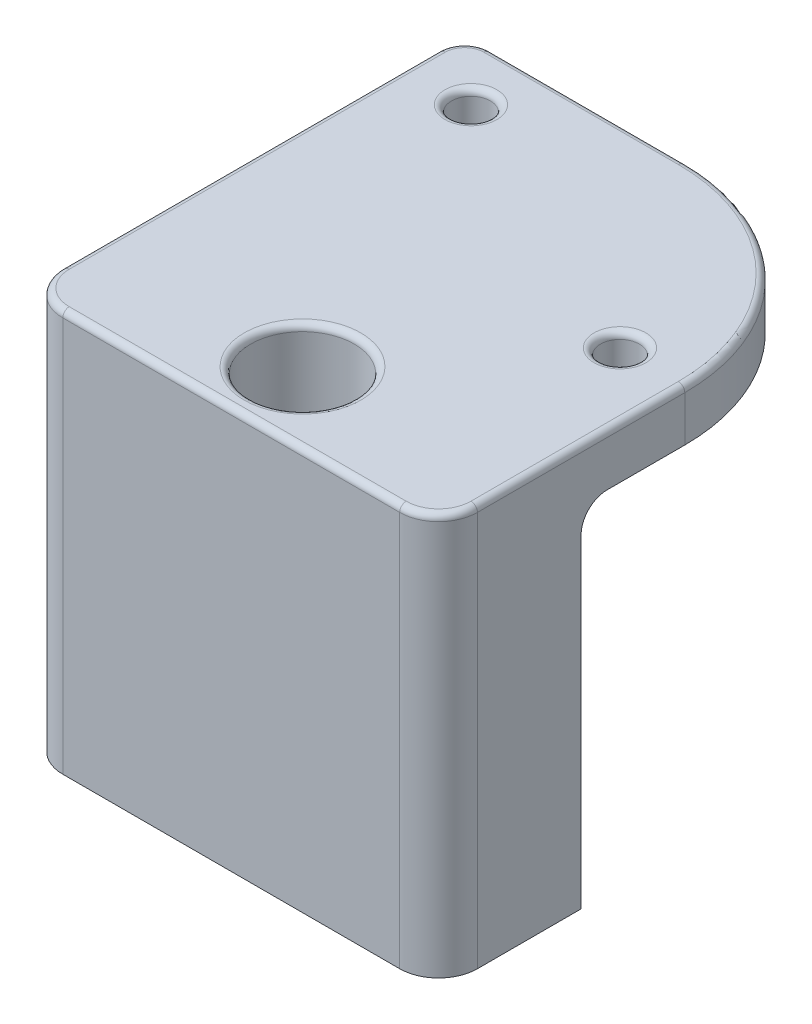
ISO-10303-21;
HEADER;
FILE_DESCRIPTION(('STEP AP214'),'2;1');
FILE_NAME('part.step','',(''),(''),'','','');
FILE_SCHEMA(('AUTOMOTIVE_DESIGN { 1 0 10303 214 1 1 1 1 }'));
ENDSEC;
DATA;
#1=APPLICATION_CONTEXT('core data for automotive mechanical design processes');
#2=APPLICATION_PROTOCOL_DEFINITION('international standard','automotive_design',2000,#1);
#3=PRODUCT_CONTEXT('',#1,'mechanical');
#4=PRODUCT('Part','Part','',(#3));
#5=PRODUCT_RELATED_PRODUCT_CATEGORY('part','',(#4));
#6=PRODUCT_DEFINITION_FORMATION('','',#4);
#7=PRODUCT_DEFINITION_CONTEXT('part definition',#1,'design');
#8=PRODUCT_DEFINITION('design','',#6,#7);
#9=PRODUCT_DEFINITION_SHAPE('','',#8);
#10=(LENGTH_UNIT() NAMED_UNIT(*) SI_UNIT(.MILLI.,.METRE.));
#11=(NAMED_UNIT(*) PLANE_ANGLE_UNIT() SI_UNIT($,.RADIAN.));
#12=(NAMED_UNIT(*) SI_UNIT($,.STERADIAN.) SOLID_ANGLE_UNIT());
#13=UNCERTAINTY_MEASURE_WITH_UNIT(LENGTH_MEASURE(1.E-05),#10,'distance_accuracy_value','');
#14=(GEOMETRIC_REPRESENTATION_CONTEXT(3) GLOBAL_UNCERTAINTY_ASSIGNED_CONTEXT((#13)) GLOBAL_UNIT_ASSIGNED_CONTEXT((#10,
#11,#12)) REPRESENTATION_CONTEXT('',''));
#15=CARTESIAN_POINT('',(0.,0.,0.));
#16=DIRECTION('',(0.,0.,1.));
#17=DIRECTION('',(1.,0.,0.));
#18=AXIS2_PLACEMENT_3D('',#15,#16,#17);
#19=CARTESIAN_POINT('',(17.,27.,-19.));
#20=DIRECTION('',(0.,1.,0.));
#21=DIRECTION('',(0.,0.,1.));
#22=AXIS2_PLACEMENT_3D('',#19,#20,#21);
#23=PLANE('',#22);
#24=CARTESIAN_POINT('',(27.,27.,-19.));
#25=DIRECTION('',(0.,1.,0.));
#26=DIRECTION('',(0.,0.,1.));
#27=AXIS2_PLACEMENT_3D('',#24,#25,#26);
#28=CIRCLE('',#27,1.5);
#29=CARTESIAN_POINT('',(27.,27.,-17.5));
#30=VERTEX_POINT('',#29);
#31=EDGE_CURVE('E176',#30,#30,#28,.T.);
#32=ORIENTED_EDGE('',*,*,#31,.T.);
#33=EDGE_LOOP('',(#32));
#34=FACE_BOUND('',#33,.T.);
#35=DIRECTION('',(0.,0.,1.));
#36=VECTOR('',#35,1.);
#37=CARTESIAN_POINT('',(0.,27.,0.));
#38=LINE('',#37,#36);
#39=CARTESIAN_POINT('',(0.,27.,-32.));
#40=VERTEX_POINT('',#39);
#41=CARTESIAN_POINT('',(0.,27.,-13.));
#42=VERTEX_POINT('',#41);
#43=EDGE_CURVE('E185',#40,#42,#38,.T.);
#44=ORIENTED_EDGE('',*,*,#43,.F.);
#45=CARTESIAN_POINT('',(2.,27.,-32.));
#46=DIRECTION('',(0.,1.,0.));
#47=DIRECTION('',(0.,0.,1.));
#48=AXIS2_PLACEMENT_3D('',#45,#46,#47);
#49=CIRCLE('',#48,2.);
#50=CARTESIAN_POINT('',(2.,27.,-34.));
#51=VERTEX_POINT('',#50);
#52=EDGE_CURVE('E260',#40,#51,#49,.F.);
#53=ORIENTED_EDGE('',*,*,#52,.T.);
#54=DIRECTION('',(-1.,0.,0.));
#55=VECTOR('',#54,1.);
#56=CARTESIAN_POINT('',(0.,27.,-34.));
#57=LINE('',#56,#55);
#58=CARTESIAN_POINT('',(16.9999999999999,27.,-34.));
#59=VERTEX_POINT('',#58);
#60=EDGE_CURVE('E181',#59,#51,#57,.T.);
#61=ORIENTED_EDGE('',*,*,#60,.F.);
#62=CARTESIAN_POINT('',(17.,27.,-19.));
#63=DIRECTION('',(0.,1.,0.));
#64=DIRECTION('',(0.,0.,1.));
#65=AXIS2_PLACEMENT_3D('',#62,#63,#64);
#66=CIRCLE('',#65,15.);
#67=CARTESIAN_POINT('',(32.,27.,-18.9999999999999));
#68=VERTEX_POINT('',#67);
#69=EDGE_CURVE('E157',#68,#59,#66,.T.);
#70=ORIENTED_EDGE('',*,*,#69,.F.);
#71=DIRECTION('',(0.,0.,-1.));
#72=VECTOR('',#71,1.);
#73=CARTESIAN_POINT('',(32.,27.,0.));
#74=LINE('',#73,#72);
#75=CARTESIAN_POINT('',(32.,27.,-13.));
#76=VERTEX_POINT('',#75);
#77=EDGE_CURVE('E167',#76,#68,#74,.T.);
#78=ORIENTED_EDGE('',*,*,#77,.F.);
#79=DIRECTION('',(-1.,0.,0.));
#80=VECTOR('',#79,1.);
#81=CARTESIAN_POINT('',(0.,27.,-13.));
#82=LINE('',#81,#80);
#83=EDGE_CURVE('E237',#76,#42,#82,.T.);
#84=ORIENTED_EDGE('',*,*,#83,.T.);
#85=EDGE_LOOP('',(#44,#53,#61,#70,#78,#84));
#86=FACE_BOUND('',#85,.T.);
#87=CARTESIAN_POINT('',(5.,27.,-29.5));
#88=DIRECTION('',(0.,1.,0.));
#89=DIRECTION('',(0.,0.,1.));
#90=AXIS2_PLACEMENT_3D('',#87,#88,#89);
#91=CIRCLE('',#90,3.);
#92=CARTESIAN_POINT('',(5.,27.,-26.5));
#93=VERTEX_POINT('',#92);
#94=EDGE_CURVE('E253',#93,#93,#91,.F.);
#95=ORIENTED_EDGE('',*,*,#94,.F.);
#96=EDGE_LOOP('',(#95));
#97=FACE_BOUND('',#96,.T.);
#98=ADVANCED_FACE('F39',(#34,#86,#97),#23,.F.);
#99=CARTESIAN_POINT('',(0.,0.,0.));
#100=DIRECTION('',(0.,-1.,0.));
#101=DIRECTION('',(0.,0.,-1.));
#102=AXIS2_PLACEMENT_3D('',#99,#100,#101);
#103=PLANE('',#102);
#104=DIRECTION('',(1.,0.,0.));
#105=VECTOR('',#104,1.);
#106=CARTESIAN_POINT('',(0.,0.,0.));
#107=LINE('',#106,#105);
#108=CARTESIAN_POINT('',(3.,0.,0.));
#109=VERTEX_POINT('',#108);
#110=CARTESIAN_POINT('',(29.,0.,0.));
#111=VERTEX_POINT('',#110);
#112=EDGE_CURVE('E200',#109,#111,#107,.T.);
#113=ORIENTED_EDGE('',*,*,#112,.F.);
#114=CARTESIAN_POINT('',(3.,0.,-3.));
#115=DIRECTION('',(0.,-1.,0.));
#116=DIRECTION('',(0.,0.,-1.));
#117=AXIS2_PLACEMENT_3D('',#114,#115,#116);
#118=CIRCLE('',#117,3.);
#119=CARTESIAN_POINT('',(0.,0.,-3.));
#120=VERTEX_POINT('',#119);
#121=EDGE_CURVE('E231',#109,#120,#118,.T.);
#122=ORIENTED_EDGE('',*,*,#121,.T.);
#123=DIRECTION('',(0.,0.,1.));
#124=VECTOR('',#123,1.);
#125=CARTESIAN_POINT('',(0.,0.,0.));
#126=LINE('',#125,#124);
#127=CARTESIAN_POINT('',(0.,0.,-11.));
#128=VERTEX_POINT('',#127);
#129=EDGE_CURVE('E196',#128,#120,#126,.T.);
#130=ORIENTED_EDGE('',*,*,#129,.F.);
#131=DIRECTION('',(-1.,0.,0.));
#132=VECTOR('',#131,1.);
#133=CARTESIAN_POINT('',(0.,0.,-11.));
#134=LINE('',#133,#132);
#135=CARTESIAN_POINT('',(32.,0.,-11.));
#136=VERTEX_POINT('',#135);
#137=EDGE_CURVE('E207',#136,#128,#134,.T.);
#138=ORIENTED_EDGE('',*,*,#137,.F.);
#139=DIRECTION('',(0.,0.,-1.));
#140=VECTOR('',#139,1.);
#141=CARTESIAN_POINT('',(32.,0.,0.));
#142=LINE('',#141,#140);
#143=CARTESIAN_POINT('',(32.,0.,-3.));
#144=VERTEX_POINT('',#143);
#145=EDGE_CURVE('E203',#144,#136,#142,.T.);
#146=ORIENTED_EDGE('',*,*,#145,.F.);
#147=CARTESIAN_POINT('',(29.,0.,-3.));
#148=DIRECTION('',(0.,-1.,0.));
#149=DIRECTION('',(0.,0.,-1.));
#150=AXIS2_PLACEMENT_3D('',#147,#148,#149);
#151=CIRCLE('',#150,3.);
#152=EDGE_CURVE('E220',#144,#111,#151,.T.);
#153=ORIENTED_EDGE('',*,*,#152,.T.);
#154=EDGE_LOOP('',(#113,#122,#130,#138,#146,#153));
#155=FACE_BOUND('',#154,.T.);
#156=CARTESIAN_POINT('',(16.,0.,-5.50000000000001));
#157=DIRECTION('',(0.,1.,0.));
#158=DIRECTION('',(0.,0.,1.));
#159=AXIS2_PLACEMENT_3D('',#156,#157,#158);
#160=CIRCLE('',#159,1.6);
#161=CARTESIAN_POINT('',(16.,0.,-3.9));
#162=VERTEX_POINT('',#161);
#163=EDGE_CURVE('E163',#162,#162,#160,.T.);
#164=ORIENTED_EDGE('',*,*,#163,.T.);
#165=EDGE_LOOP('',(#164));
#166=FACE_BOUND('',#165,.T.);
#167=ADVANCED_FACE('F400',(#155,#166),#103,.T.);
#168=CARTESIAN_POINT('',(0.,27.,0.));
#169=DIRECTION('',(1.,0.,0.));
#170=DIRECTION('',(0.,0.,-1.));
#171=AXIS2_PLACEMENT_3D('',#168,#169,#170);
#172=PLANE('',#171);
#173=DIRECTION('',(0.,-1.,0.));
#174=VECTOR('',#173,1.);
#175=CARTESIAN_POINT('',(0.,27.,-3.));
#176=LINE('',#175,#174);
#177=CARTESIAN_POINT('',(0.,30.5,-3.));
#178=VERTEX_POINT('',#177);
#179=EDGE_CURVE('E234',#120,#178,#176,.F.);
#180=ORIENTED_EDGE('',*,*,#179,.T.);
#181=DIRECTION('',(0.,0.,1.));
#182=VECTOR('',#181,1.);
#183=CARTESIAN_POINT('',(0.,30.5,-32.));
#184=LINE('',#183,#182);
#185=CARTESIAN_POINT('',(0.,30.5,-32.));
#186=VERTEX_POINT('',#185);
#187=EDGE_CURVE('E65',#178,#186,#184,.F.);
#188=ORIENTED_EDGE('',*,*,#187,.T.);
#189=DIRECTION('',(0.,-1.,0.));
#190=VECTOR('',#189,1.);
#191=CARTESIAN_POINT('',(0.,27.,-32.));
#192=LINE('',#191,#190);
#193=EDGE_CURVE('E257',#186,#40,#192,.T.);
#194=ORIENTED_EDGE('',*,*,#193,.T.);
#195=ORIENTED_EDGE('',*,*,#43,.T.);
#196=CARTESIAN_POINT('',(0.,25.,-13.));
#197=DIRECTION('',(1.,0.,0.));
#198=DIRECTION('',(0.,0.,-1.));
#199=AXIS2_PLACEMENT_3D('',#196,#197,#198);
#200=CIRCLE('',#199,2.);
#201=CARTESIAN_POINT('',(0.,25.,-11.));
#202=VERTEX_POINT('',#201);
#203=EDGE_CURVE('E248',#42,#202,#200,.T.);
#204=ORIENTED_EDGE('',*,*,#203,.T.);
#205=DIRECTION('',(0.,-1.,0.));
#206=VECTOR('',#205,1.);
#207=CARTESIAN_POINT('',(0.,27.,-11.));
#208=LINE('',#207,#206);
#209=EDGE_CURVE('E211',#202,#128,#208,.T.);
#210=ORIENTED_EDGE('',*,*,#209,.T.);
#211=ORIENTED_EDGE('',*,*,#129,.T.);
#212=EDGE_LOOP('',(#180,#188,#194,#195,#204,#210,#211));
#213=FACE_BOUND('',#212,.T.);
#214=ADVANCED_FACE('F405',(#213),#172,.F.);
#215=CARTESIAN_POINT('',(0.,27.,0.));
#216=DIRECTION('',(0.,0.,-1.));
#217=DIRECTION('',(-1.,0.,0.));
#218=AXIS2_PLACEMENT_3D('',#215,#216,#217);
#219=PLANE('',#218);
#220=DIRECTION('',(0.,-1.,0.));
#221=VECTOR('',#220,1.);
#222=CARTESIAN_POINT('',(29.,27.,0.));
#223=LINE('',#222,#221);
#224=CARTESIAN_POINT('',(29.,30.5,0.));
#225=VERTEX_POINT('',#224);
#226=EDGE_CURVE('E224',#111,#225,#223,.F.);
#227=ORIENTED_EDGE('',*,*,#226,.T.);
#228=DIRECTION('',(1.,0.,0.));
#229=VECTOR('',#228,1.);
#230=CARTESIAN_POINT('',(3.,30.5,0.));
#231=LINE('',#230,#229);
#232=CARTESIAN_POINT('',(3.,30.5,0.));
#233=VERTEX_POINT('',#232);
#234=EDGE_CURVE('E315',#225,#233,#231,.F.);
#235=ORIENTED_EDGE('',*,*,#234,.T.);
#236=DIRECTION('',(0.,-1.,0.));
#237=VECTOR('',#236,1.);
#238=CARTESIAN_POINT('',(3.,27.,0.));
#239=LINE('',#238,#237);
#240=EDGE_CURVE('E228',#233,#109,#239,.T.);
#241=ORIENTED_EDGE('',*,*,#240,.T.);
#242=ORIENTED_EDGE('',*,*,#112,.T.);
#243=EDGE_LOOP('',(#227,#235,#241,#242));
#244=FACE_BOUND('',#243,.T.);
#245=ADVANCED_FACE('F426',(#244),#219,.F.);
#246=CARTESIAN_POINT('',(32.,27.,0.));
#247=DIRECTION('',(-1.,0.,0.));
#248=DIRECTION('',(0.,0.,1.));
#249=AXIS2_PLACEMENT_3D('',#246,#247,#248);
#250=PLANE('',#249);
#251=DIRECTION('',(0.,-1.,0.));
#252=VECTOR('',#251,1.);
#253=CARTESIAN_POINT('',(32.,31.,-18.9999999999999));
#254=LINE('',#253,#252);
#255=CARTESIAN_POINT('',(32.,30.5,-18.9999999999999));
#256=VERTEX_POINT('',#255);
#257=EDGE_CURVE('E152',#256,#68,#254,.T.);
#258=ORIENTED_EDGE('',*,*,#257,.F.);
#259=DIRECTION('',(0.,0.,-1.));
#260=VECTOR('',#259,1.);
#261=CARTESIAN_POINT('',(32.,30.5,-3.00000000000001));
#262=LINE('',#261,#260);
#263=CARTESIAN_POINT('',(32.,30.5,-3.));
#264=VERTEX_POINT('',#263);
#265=EDGE_CURVE('E309',#256,#264,#262,.F.);
#266=ORIENTED_EDGE('',*,*,#265,.T.);
#267=DIRECTION('',(0.,-1.,0.));
#268=VECTOR('',#267,1.);
#269=CARTESIAN_POINT('',(32.,27.,-3.));
#270=LINE('',#269,#268);
#271=EDGE_CURVE('E217',#264,#144,#270,.T.);
#272=ORIENTED_EDGE('',*,*,#271,.T.);
#273=ORIENTED_EDGE('',*,*,#145,.T.);
#274=DIRECTION('',(0.,-1.,0.));
#275=VECTOR('',#274,1.);
#276=CARTESIAN_POINT('',(32.,27.,-11.));
#277=LINE('',#276,#275);
#278=CARTESIAN_POINT('',(32.,25.,-11.));
#279=VERTEX_POINT('',#278);
#280=EDGE_CURVE('E214',#279,#136,#277,.T.);
#281=ORIENTED_EDGE('',*,*,#280,.F.);
#282=CARTESIAN_POINT('',(32.,25.,-13.));
#283=DIRECTION('',(-1.,0.,0.));
#284=DIRECTION('',(0.,0.,1.));
#285=AXIS2_PLACEMENT_3D('',#282,#283,#284);
#286=CIRCLE('',#285,2.);
#287=EDGE_CURVE('E171',#279,#76,#286,.T.);
#288=ORIENTED_EDGE('',*,*,#287,.T.);
#289=ORIENTED_EDGE('',*,*,#77,.T.);
#290=EDGE_LOOP('',(#258,#266,#272,#273,#281,#288,#289));
#291=FACE_BOUND('',#290,.T.);
#292=ADVANCED_FACE('F168',(#291),#250,.F.);
#293=CARTESIAN_POINT('',(0.,27.,-11.));
#294=DIRECTION('',(0.,0.,1.));
#295=DIRECTION('',(1.,0.,0.));
#296=AXIS2_PLACEMENT_3D('',#293,#294,#295);
#297=PLANE('',#296);
#298=ORIENTED_EDGE('',*,*,#209,.F.);
#299=DIRECTION('',(-1.,0.,0.));
#300=VECTOR('',#299,1.);
#301=CARTESIAN_POINT('',(32.,25.,-11.));
#302=LINE('',#301,#300);
#303=EDGE_CURVE('E245',#202,#279,#302,.F.);
#304=ORIENTED_EDGE('',*,*,#303,.T.);
#305=ORIENTED_EDGE('',*,*,#280,.T.);
#306=ORIENTED_EDGE('',*,*,#137,.T.);
#307=EDGE_LOOP('',(#298,#304,#305,#306));
#308=FACE_BOUND('',#307,.T.);
#309=ADVANCED_FACE('F418',(#308),#297,.F.);
#310=CARTESIAN_POINT('',(16.,27.,-5.50000000000001));
#311=DIRECTION('',(0.,-1.,0.));
#312=DIRECTION('',(0.,0.,-1.));
#313=AXIS2_PLACEMENT_3D('',#310,#311,#312);
#314=CYLINDRICAL_SURFACE('',#313,1.6);
#315=CARTESIAN_POINT('',(16.,17.,-5.50000000000001));
#316=DIRECTION('',(0.,-1.,0.));
#317=DIRECTION('',(0.,0.,-1.));
#318=AXIS2_PLACEMENT_3D('',#315,#316,#317);
#319=CIRCLE('',#318,1.6);
#320=CARTESIAN_POINT('',(16.,17.,-7.10000000000001));
#321=VERTEX_POINT('',#320);
#322=EDGE_CURVE('E238',#321,#321,#319,.T.);
#323=ORIENTED_EDGE('',*,*,#322,.F.);
#324=EDGE_LOOP('',(#323));
#325=FACE_BOUND('',#324,.T.);
#326=ORIENTED_EDGE('',*,*,#163,.F.);
#327=EDGE_LOOP('',(#326));
#328=FACE_BOUND('',#327,.T.);
#329=ADVANCED_FACE('F416',(#325,#328),#314,.F.);
#330=CARTESIAN_POINT('',(17.,31.,-19.));
#331=DIRECTION('',(0.,1.,0.));
#332=DIRECTION('',(0.,0.,1.));
#333=AXIS2_PLACEMENT_3D('',#330,#331,#332);
#334=PLANE('',#333);
#335=CARTESIAN_POINT('',(27.,31.,-19.));
#336=DIRECTION('',(0.,1.,0.));
#337=DIRECTION('',(0.,0.,1.));
#338=AXIS2_PLACEMENT_3D('',#335,#336,#337);
#339=CIRCLE('',#338,2.);
#340=CARTESIAN_POINT('',(27.,31.,-17.));
#341=VERTEX_POINT('',#340);
#342=EDGE_CURVE('E303',#341,#341,#339,.F.);
#343=ORIENTED_EDGE('',*,*,#342,.T.);
#344=EDGE_LOOP('',(#343));
#345=FACE_BOUND('',#344,.T.);
#346=DIRECTION('',(0.,0.,-1.));
#347=VECTOR('',#346,1.);
#348=CARTESIAN_POINT('',(31.5,31.,-18.9999999999999));
#349=LINE('',#348,#347);
#350=CARTESIAN_POINT('',(31.5,31.,-3.));
#351=VERTEX_POINT('',#350);
#352=CARTESIAN_POINT('',(31.5,31.,-18.9999999999999));
#353=VERTEX_POINT('',#352);
#354=EDGE_CURVE('E296',#351,#353,#349,.T.);
#355=ORIENTED_EDGE('',*,*,#354,.T.);
#356=CARTESIAN_POINT('',(17.,31.,-19.));
#357=DIRECTION('',(0.,1.,0.));
#358=DIRECTION('',(0.,0.,1.));
#359=AXIS2_PLACEMENT_3D('',#356,#357,#358);
#360=CIRCLE('',#359,14.5);
#361=CARTESIAN_POINT('',(16.9999999999999,31.,-33.5));
#362=VERTEX_POINT('',#361);
#363=EDGE_CURVE('E299',#353,#362,#360,.T.);
#364=ORIENTED_EDGE('',*,*,#363,.T.);
#365=DIRECTION('',(-1.,0.,0.));
#366=VECTOR('',#365,1.);
#367=CARTESIAN_POINT('',(2.,31.,-33.5));
#368=LINE('',#367,#366);
#369=CARTESIAN_POINT('',(2.,31.,-33.5));
#370=VERTEX_POINT('',#369);
#371=EDGE_CURVE('E278',#362,#370,#368,.T.);
#372=ORIENTED_EDGE('',*,*,#371,.T.);
#373=CARTESIAN_POINT('',(2.,31.,-32.));
#374=DIRECTION('',(0.,1.,0.));
#375=DIRECTION('',(0.,0.,1.));
#376=AXIS2_PLACEMENT_3D('',#373,#374,#375);
#377=CIRCLE('',#376,1.5);
#378=CARTESIAN_POINT('',(0.5,31.,-32.));
#379=VERTEX_POINT('',#378);
#380=EDGE_CURVE('E281',#370,#379,#377,.T.);
#381=ORIENTED_EDGE('',*,*,#380,.T.);
#382=DIRECTION('',(0.,0.,1.));
#383=VECTOR('',#382,1.);
#384=CARTESIAN_POINT('',(0.5,31.,-3.));
#385=LINE('',#384,#383);
#386=CARTESIAN_POINT('',(0.5,31.,-3.));
#387=VERTEX_POINT('',#386);
#388=EDGE_CURVE('E284',#379,#387,#385,.T.);
#389=ORIENTED_EDGE('',*,*,#388,.T.);
#390=CARTESIAN_POINT('',(3.,31.,-3.));
#391=DIRECTION('',(0.,1.,0.));
#392=DIRECTION('',(0.,0.,1.));
#393=AXIS2_PLACEMENT_3D('',#390,#391,#392);
#394=CIRCLE('',#393,2.5);
#395=CARTESIAN_POINT('',(3.,31.,-0.5));
#396=VERTEX_POINT('',#395);
#397=EDGE_CURVE('E287',#387,#396,#394,.T.);
#398=ORIENTED_EDGE('',*,*,#397,.T.);
#399=DIRECTION('',(1.,0.,0.));
#400=VECTOR('',#399,1.);
#401=CARTESIAN_POINT('',(29.,31.,-0.500000000000006));
#402=LINE('',#401,#400);
#403=CARTESIAN_POINT('',(29.,31.,-0.500000000000006));
#404=VERTEX_POINT('',#403);
#405=EDGE_CURVE('E290',#396,#404,#402,.T.);
#406=ORIENTED_EDGE('',*,*,#405,.T.);
#407=CARTESIAN_POINT('',(29.,31.,-3.));
#408=DIRECTION('',(0.,1.,0.));
#409=DIRECTION('',(0.,0.,1.));
#410=AXIS2_PLACEMENT_3D('',#407,#408,#409);
#411=CIRCLE('',#410,2.5);
#412=EDGE_CURVE('E293',#404,#351,#411,.T.);
#413=ORIENTED_EDGE('',*,*,#412,.T.);
#414=EDGE_LOOP('',(#355,#364,#372,#381,#389,#398,#406,#413));
#415=FACE_BOUND('',#414,.T.);
#416=CARTESIAN_POINT('',(5.,31.,-29.5));
#417=DIRECTION('',(0.,1.,0.));
#418=DIRECTION('',(0.,0.,1.));
#419=AXIS2_PLACEMENT_3D('',#416,#417,#418);
#420=CIRCLE('',#419,2.);
#421=CARTESIAN_POINT('',(5.,31.,-27.5));
#422=VERTEX_POINT('',#421);
#423=EDGE_CURVE('E274',#422,#422,#420,.F.);
#424=ORIENTED_EDGE('',*,*,#423,.T.);
#425=EDGE_LOOP('',(#424));
#426=FACE_BOUND('',#425,.T.);
#427=CARTESIAN_POINT('',(16.,31.,-5.50000000000001));
#428=DIRECTION('',(0.,1.,0.));
#429=DIRECTION('',(0.,0.,1.));
#430=AXIS2_PLACEMENT_3D('',#427,#428,#429);
#431=CIRCLE('',#430,4.5);
#432=CARTESIAN_POINT('',(16.,31.,-1.00000000000001));
#433=VERTEX_POINT('',#432);
#434=EDGE_CURVE('E270',#433,#433,#431,.F.);
#435=ORIENTED_EDGE('',*,*,#434,.T.);
#436=EDGE_LOOP('',(#435));
#437=FACE_BOUND('',#436,.T.);
#438=ADVANCED_FACE('F410',(#345,#415,#426,#437),#334,.T.);
#439=CARTESIAN_POINT('',(17.,31.,-19.));
#440=DIRECTION('',(0.,-1.,0.));
#441=DIRECTION('',(0.,0.,-1.));
#442=AXIS2_PLACEMENT_3D('',#439,#440,#441);
#443=CYLINDRICAL_SURFACE('',#442,15.);
#444=DIRECTION('',(0.,-1.,0.));
#445=VECTOR('',#444,1.);
#446=CARTESIAN_POINT('',(16.9999999999999,31.,-34.));
#447=LINE('',#446,#445);
#448=CARTESIAN_POINT('',(16.9999999999999,30.5,-34.));
#449=VERTEX_POINT('',#448);
#450=EDGE_CURVE('E164',#449,#59,#447,.T.);
#451=ORIENTED_EDGE('',*,*,#450,.F.);
#452=CARTESIAN_POINT('',(17.,30.5,-19.));
#453=DIRECTION('',(0.,1.,0.));
#454=DIRECTION('',(0.,0.,1.));
#455=AXIS2_PLACEMENT_3D('',#452,#453,#454);
#456=CIRCLE('',#455,15.);
#457=EDGE_CURVE('E160',#449,#256,#456,.F.);
#458=ORIENTED_EDGE('',*,*,#457,.T.);
#459=ORIENTED_EDGE('',*,*,#257,.T.);
#460=ORIENTED_EDGE('',*,*,#69,.T.);
#461=EDGE_LOOP('',(#451,#458,#459,#460));
#462=FACE_BOUND('',#461,.T.);
#463=ADVANCED_FACE('F155',(#462),#443,.T.);
#464=CARTESIAN_POINT('',(0.,31.,-34.));
#465=DIRECTION('',(0.,0.,1.));
#466=DIRECTION('',(1.,0.,0.));
#467=AXIS2_PLACEMENT_3D('',#464,#465,#466);
#468=PLANE('',#467);
#469=DIRECTION('',(0.,-1.,0.));
#470=VECTOR('',#469,1.);
#471=CARTESIAN_POINT('',(2.,31.,-34.));
#472=LINE('',#471,#470);
#473=CARTESIAN_POINT('',(2.,30.5,-34.));
#474=VERTEX_POINT('',#473);
#475=EDGE_CURVE('E263',#51,#474,#472,.F.);
#476=ORIENTED_EDGE('',*,*,#475,.T.);
#477=DIRECTION('',(-1.,0.,0.));
#478=VECTOR('',#477,1.);
#479=CARTESIAN_POINT('',(16.9999999999999,30.5,-34.));
#480=LINE('',#479,#478);
#481=EDGE_CURVE('E325',#474,#449,#480,.F.);
#482=ORIENTED_EDGE('',*,*,#481,.T.);
#483=ORIENTED_EDGE('',*,*,#450,.T.);
#484=ORIENTED_EDGE('',*,*,#60,.T.);
#485=EDGE_LOOP('',(#476,#482,#483,#484));
#486=FACE_BOUND('',#485,.T.);
#487=ADVANCED_FACE('F395',(#486),#468,.F.);
#488=CARTESIAN_POINT('',(5.,31.,-29.5));
#489=DIRECTION('',(0.,-1.,0.));
#490=DIRECTION('',(0.,0.,-1.));
#491=AXIS2_PLACEMENT_3D('',#488,#489,#490);
#492=CYLINDRICAL_SURFACE('',#491,1.5);
#493=CARTESIAN_POINT('',(5.,30.5,-29.5));
#494=DIRECTION('',(0.,1.,0.));
#495=DIRECTION('',(0.,0.,1.));
#496=AXIS2_PLACEMENT_3D('',#493,#494,#495);
#497=CIRCLE('',#496,1.5);
#498=CARTESIAN_POINT('',(5.,30.5,-28.));
#499=VERTEX_POINT('',#498);
#500=EDGE_CURVE('E49',#499,#499,#497,.T.);
#501=ORIENTED_EDGE('',*,*,#500,.T.);
#502=EDGE_LOOP('',(#501));
#503=FACE_BOUND('',#502,.T.);
#504=CARTESIAN_POINT('',(5.,17.5,-29.5));
#505=DIRECTION('',(0.,-1.,0.));
#506=DIRECTION('',(0.,0.,-1.));
#507=AXIS2_PLACEMENT_3D('',#504,#505,#506);
#508=CIRCLE('',#507,1.5);
#509=CARTESIAN_POINT('',(5.,17.5,-31.));
#510=VERTEX_POINT('',#509);
#511=EDGE_CURVE('E360',#510,#510,#508,.T.);
#512=ORIENTED_EDGE('',*,*,#511,.T.);
#513=EDGE_LOOP('',(#512));
#514=FACE_BOUND('',#513,.T.);
#515=ADVANCED_FACE('F385',(#503,#514),#492,.F.);
#516=CARTESIAN_POINT('',(27.,31.,-19.));
#517=DIRECTION('',(0.,-1.,0.));
#518=DIRECTION('',(0.,0.,-1.));
#519=AXIS2_PLACEMENT_3D('',#516,#517,#518);
#520=CYLINDRICAL_SURFACE('',#519,1.5);
#521=CARTESIAN_POINT('',(27.,30.5,-19.));
#522=DIRECTION('',(0.,1.,0.));
#523=DIRECTION('',(0.,0.,1.));
#524=AXIS2_PLACEMENT_3D('',#521,#522,#523);
#525=CIRCLE('',#524,1.5);
#526=CARTESIAN_POINT('',(27.,30.5,-17.5));
#527=VERTEX_POINT('',#526);
#528=EDGE_CURVE('E266',#527,#527,#525,.T.);
#529=ORIENTED_EDGE('',*,*,#528,.T.);
#530=EDGE_LOOP('',(#529));
#531=FACE_BOUND('',#530,.T.);
#532=ORIENTED_EDGE('',*,*,#31,.F.);
#533=EDGE_LOOP('',(#532));
#534=FACE_BOUND('',#533,.T.);
#535=ADVANCED_FACE('F382',(#531,#534),#520,.F.);
#536=CARTESIAN_POINT('',(29.,27.,-3.));
#537=DIRECTION('',(0.,-1.,0.));
#538=DIRECTION('',(0.,0.,-1.));
#539=AXIS2_PLACEMENT_3D('',#536,#537,#538);
#540=CYLINDRICAL_SURFACE('',#539,3.);
#541=ORIENTED_EDGE('',*,*,#271,.F.);
#542=CARTESIAN_POINT('',(29.,30.5,-3.));
#543=DIRECTION('',(0.,1.,0.));
#544=DIRECTION('',(0.,0.,1.));
#545=AXIS2_PLACEMENT_3D('',#542,#543,#544);
#546=CIRCLE('',#545,3.);
#547=EDGE_CURVE('E312',#264,#225,#546,.F.);
#548=ORIENTED_EDGE('',*,*,#547,.T.);
#549=ORIENTED_EDGE('',*,*,#226,.F.);
#550=ORIENTED_EDGE('',*,*,#152,.F.);
#551=EDGE_LOOP('',(#541,#548,#549,#550));
#552=FACE_BOUND('',#551,.T.);
#553=ADVANCED_FACE('F384',(#552),#540,.T.);
#554=CARTESIAN_POINT('',(3.,27.,-3.));
#555=DIRECTION('',(0.,-1.,0.));
#556=DIRECTION('',(0.,0.,-1.));
#557=AXIS2_PLACEMENT_3D('',#554,#555,#556);
#558=CYLINDRICAL_SURFACE('',#557,3.);
#559=ORIENTED_EDGE('',*,*,#240,.F.);
#560=CARTESIAN_POINT('',(3.,30.5,-3.));
#561=DIRECTION('',(0.,1.,0.));
#562=DIRECTION('',(0.,0.,1.));
#563=AXIS2_PLACEMENT_3D('',#560,#561,#562);
#564=CIRCLE('',#563,3.);
#565=EDGE_CURVE('E318',#233,#178,#564,.F.);
#566=ORIENTED_EDGE('',*,*,#565,.T.);
#567=ORIENTED_EDGE('',*,*,#179,.F.);
#568=ORIENTED_EDGE('',*,*,#121,.F.);
#569=EDGE_LOOP('',(#559,#566,#567,#568));
#570=FACE_BOUND('',#569,.T.);
#571=ADVANCED_FACE('F392',(#570),#558,.T.);
#572=CARTESIAN_POINT('',(16.,32.,-5.50000000000001));
#573=DIRECTION('',(0.,-1.,0.));
#574=DIRECTION('',(0.,0.,-1.));
#575=AXIS2_PLACEMENT_3D('',#572,#573,#574);
#576=CYLINDRICAL_SURFACE('',#575,4.);
#577=CARTESIAN_POINT('',(16.,30.5,-5.50000000000001));
#578=DIRECTION('',(0.,1.,0.));
#579=DIRECTION('',(0.,0.,1.));
#580=AXIS2_PLACEMENT_3D('',#577,#578,#579);
#581=CIRCLE('',#580,4.);
#582=CARTESIAN_POINT('',(16.,30.5,-1.50000000000001));
#583=VERTEX_POINT('',#582);
#584=EDGE_CURVE('E11',#583,#583,#581,.T.);
#585=ORIENTED_EDGE('',*,*,#584,.T.);
#586=EDGE_LOOP('',(#585));
#587=FACE_BOUND('',#586,.T.);
#588=CARTESIAN_POINT('',(16.,17.,-5.50000000000001));
#589=DIRECTION('',(0.,-1.,0.));
#590=DIRECTION('',(0.,0.,-1.));
#591=AXIS2_PLACEMENT_3D('',#588,#589,#590);
#592=CIRCLE('',#591,4.);
#593=CARTESIAN_POINT('',(16.,17.,-9.50000000000001));
#594=VERTEX_POINT('',#593);
#595=EDGE_CURVE('E242',#594,#594,#592,.T.);
#596=ORIENTED_EDGE('',*,*,#595,.T.);
#597=EDGE_LOOP('',(#596));
#598=FACE_BOUND('',#597,.T.);
#599=ADVANCED_FACE('F434',(#587,#598),#576,.F.);
#600=CARTESIAN_POINT('',(16.,17.,-5.50000000000001));
#601=DIRECTION('',(0.,-1.,0.));
#602=DIRECTION('',(0.,0.,-1.));
#603=AXIS2_PLACEMENT_3D('',#600,#601,#602);
#604=PLANE('',#603);
#605=ORIENTED_EDGE('',*,*,#322,.T.);
#606=EDGE_LOOP('',(#605));
#607=FACE_BOUND('',#606,.T.);
#608=ORIENTED_EDGE('',*,*,#595,.F.);
#609=EDGE_LOOP('',(#608));
#610=FACE_BOUND('',#609,.T.);
#611=ADVANCED_FACE('F440',(#607,#610),#604,.F.);
#612=CARTESIAN_POINT('',(17.,25.,-13.));
#613=DIRECTION('',(1.,0.,0.));
#614=DIRECTION('',(0.,0.,-1.));
#615=AXIS2_PLACEMENT_3D('',#612,#613,#614);
#616=CYLINDRICAL_SURFACE('',#615,2.);
#617=ORIENTED_EDGE('',*,*,#287,.F.);
#618=ORIENTED_EDGE('',*,*,#303,.F.);
#619=ORIENTED_EDGE('',*,*,#203,.F.);
#620=ORIENTED_EDGE('',*,*,#83,.F.);
#621=EDGE_LOOP('',(#617,#618,#619,#620));
#622=FACE_BOUND('',#621,.T.);
#623=ADVANCED_FACE('F436',(#622),#616,.F.);
#624=CARTESIAN_POINT('',(5.,17.5,-29.5));
#625=DIRECTION('',(0.,-1.,0.));
#626=DIRECTION('',(0.,0.,-1.));
#627=AXIS2_PLACEMENT_3D('',#624,#625,#626);
#628=PLANE('',#627);
#629=CARTESIAN_POINT('',(5.,17.5,-29.5));
#630=DIRECTION('',(0.,-1.,0.));
#631=DIRECTION('',(0.,0.,-1.));
#632=AXIS2_PLACEMENT_3D('',#629,#630,#631);
#633=CIRCLE('',#632,3.);
#634=CARTESIAN_POINT('',(5.,17.5,-32.5));
#635=VERTEX_POINT('',#634);
#636=EDGE_CURVE('E367',#635,#635,#633,.T.);
#637=ORIENTED_EDGE('',*,*,#636,.T.);
#638=EDGE_LOOP('',(#637));
#639=FACE_BOUND('',#638,.T.);
#640=ORIENTED_EDGE('',*,*,#511,.F.);
#641=EDGE_LOOP('',(#640));
#642=FACE_BOUND('',#641,.T.);
#643=ADVANCED_FACE('F439',(#639,#642),#628,.T.);
#644=CARTESIAN_POINT('',(5.,17.5,-29.5));
#645=DIRECTION('',(0.,1.,0.));
#646=DIRECTION('',(0.,0.,1.));
#647=AXIS2_PLACEMENT_3D('',#644,#645,#646);
#648=CYLINDRICAL_SURFACE('',#647,3.);
#649=ORIENTED_EDGE('',*,*,#636,.F.);
#650=EDGE_LOOP('',(#649));
#651=FACE_BOUND('',#650,.T.);
#652=ORIENTED_EDGE('',*,*,#94,.T.);
#653=EDGE_LOOP('',(#652));
#654=FACE_BOUND('',#653,.T.);
#655=ADVANCED_FACE('F446',(#651,#654),#648,.T.);
#656=CARTESIAN_POINT('',(2.,27.,-32.));
#657=DIRECTION('',(0.,-1.,0.));
#658=DIRECTION('',(0.,0.,-1.));
#659=AXIS2_PLACEMENT_3D('',#656,#657,#658);
#660=CYLINDRICAL_SURFACE('',#659,2.);
#661=ORIENTED_EDGE('',*,*,#193,.F.);
#662=CARTESIAN_POINT('',(2.,30.5,-32.));
#663=DIRECTION('',(0.,1.,0.));
#664=DIRECTION('',(0.,0.,1.));
#665=AXIS2_PLACEMENT_3D('',#662,#663,#664);
#666=CIRCLE('',#665,2.);
#667=EDGE_CURVE('E57',#186,#474,#666,.F.);
#668=ORIENTED_EDGE('',*,*,#667,.T.);
#669=ORIENTED_EDGE('',*,*,#475,.F.);
#670=ORIENTED_EDGE('',*,*,#52,.F.);
#671=EDGE_LOOP('',(#661,#668,#669,#670));
#672=FACE_BOUND('',#671,.T.);
#673=ADVANCED_FACE('F442',(#672),#660,.T.);
#674=CARTESIAN_POINT('',(27.,30.5,-19.));
#675=DIRECTION('',(0.,1.,0.));
#676=DIRECTION('',(0.,0.,1.));
#677=AXIS2_PLACEMENT_3D('',#674,#675,#676);
#678=TOROIDAL_SURFACE('',#677,2.,0.5);
#679=ORIENTED_EDGE('',*,*,#342,.F.);
#680=EDGE_LOOP('',(#679));
#681=FACE_BOUND('',#680,.T.);
#682=ORIENTED_EDGE('',*,*,#528,.F.);
#683=EDGE_LOOP('',(#682));
#684=FACE_BOUND('',#683,.T.);
#685=ADVANCED_FACE('F445',(#681,#684),#678,.T.);
#686=CARTESIAN_POINT('',(3.,30.5,-3.));
#687=DIRECTION('',(0.,1.,0.));
#688=DIRECTION('',(0.,0.,1.));
#689=AXIS2_PLACEMENT_3D('',#686,#687,#688);
#690=TOROIDAL_SURFACE('',#689,2.5,0.5);
#691=CARTESIAN_POINT('',(0.5,30.5,-3.));
#692=DIRECTION('',(0.,0.,-1.));
#693=DIRECTION('',(-1.,0.,0.));
#694=AXIS2_PLACEMENT_3D('',#691,#692,#693);
#695=CIRCLE('',#694,0.5);
#696=EDGE_CURVE('E352',#178,#387,#695,.T.);
#697=ORIENTED_EDGE('',*,*,#696,.F.);
#698=ORIENTED_EDGE('',*,*,#565,.F.);
#699=CARTESIAN_POINT('',(3.,30.5,-0.5));
#700=DIRECTION('',(1.,0.,0.));
#701=DIRECTION('',(0.,0.,-1.));
#702=AXIS2_PLACEMENT_3D('',#699,#700,#701);
#703=CIRCLE('',#702,0.5);
#704=EDGE_CURVE('E43',#396,#233,#703,.T.);
#705=ORIENTED_EDGE('',*,*,#704,.F.);
#706=ORIENTED_EDGE('',*,*,#397,.F.);
#707=EDGE_LOOP('',(#697,#698,#705,#706));
#708=FACE_BOUND('',#707,.T.);
#709=ADVANCED_FACE('F449',(#708),#690,.T.);
#710=CARTESIAN_POINT('',(17.,30.5,-0.500000000000004));
#711=DIRECTION('',(-1.,0.,0.));
#712=DIRECTION('',(0.,0.,1.));
#713=AXIS2_PLACEMENT_3D('',#710,#711,#712);
#714=CYLINDRICAL_SURFACE('',#713,0.5);
#715=ORIENTED_EDGE('',*,*,#704,.T.);
#716=ORIENTED_EDGE('',*,*,#234,.F.);
#717=CARTESIAN_POINT('',(29.,30.5,-0.500000000000006));
#718=DIRECTION('',(1.,0.,0.));
#719=DIRECTION('',(0.,0.,-1.));
#720=AXIS2_PLACEMENT_3D('',#717,#718,#719);
#721=CIRCLE('',#720,0.5);
#722=EDGE_CURVE('E349',#404,#225,#721,.T.);
#723=ORIENTED_EDGE('',*,*,#722,.F.);
#724=ORIENTED_EDGE('',*,*,#405,.F.);
#725=EDGE_LOOP('',(#715,#716,#723,#724));
#726=FACE_BOUND('',#725,.T.);
#727=ADVANCED_FACE('F475',(#726),#714,.T.);
#728=CARTESIAN_POINT('',(0.5,30.5,-19.));
#729=DIRECTION('',(0.,0.,-1.));
#730=DIRECTION('',(-1.,0.,0.));
#731=AXIS2_PLACEMENT_3D('',#728,#729,#730);
#732=CYLINDRICAL_SURFACE('',#731,0.5);
#733=ORIENTED_EDGE('',*,*,#696,.T.);
#734=ORIENTED_EDGE('',*,*,#388,.F.);
#735=CARTESIAN_POINT('',(0.5,30.5,-32.));
#736=DIRECTION('',(0.,0.,-1.));
#737=DIRECTION('',(-1.,0.,0.));
#738=AXIS2_PLACEMENT_3D('',#735,#736,#737);
#739=CIRCLE('',#738,0.5);
#740=EDGE_CURVE('E345',#186,#379,#739,.T.);
#741=ORIENTED_EDGE('',*,*,#740,.F.);
#742=ORIENTED_EDGE('',*,*,#187,.F.);
#743=EDGE_LOOP('',(#733,#734,#741,#742));
#744=FACE_BOUND('',#743,.T.);
#745=ADVANCED_FACE('F471',(#744),#732,.T.);
#746=CARTESIAN_POINT('',(29.,30.5,-3.));
#747=DIRECTION('',(0.,1.,0.));
#748=DIRECTION('',(0.,0.,1.));
#749=AXIS2_PLACEMENT_3D('',#746,#747,#748);
#750=TOROIDAL_SURFACE('',#749,2.5,0.5);
#751=ORIENTED_EDGE('',*,*,#722,.T.);
#752=ORIENTED_EDGE('',*,*,#547,.F.);
#753=CARTESIAN_POINT('',(31.5,30.5,-3.));
#754=DIRECTION('',(0.,0.,-1.));
#755=DIRECTION('',(-1.,0.,0.));
#756=AXIS2_PLACEMENT_3D('',#753,#754,#755);
#757=CIRCLE('',#756,0.5);
#758=EDGE_CURVE('E341',#351,#264,#757,.T.);
#759=ORIENTED_EDGE('',*,*,#758,.F.);
#760=ORIENTED_EDGE('',*,*,#412,.F.);
#761=EDGE_LOOP('',(#751,#752,#759,#760));
#762=FACE_BOUND('',#761,.T.);
#763=ADVANCED_FACE('F467',(#762),#750,.T.);
#764=CARTESIAN_POINT('',(2.,30.5,-32.));
#765=DIRECTION('',(0.,1.,0.));
#766=DIRECTION('',(0.,0.,1.));
#767=AXIS2_PLACEMENT_3D('',#764,#765,#766);
#768=TOROIDAL_SURFACE('',#767,1.5,0.5);
#769=ORIENTED_EDGE('',*,*,#740,.T.);
#770=ORIENTED_EDGE('',*,*,#380,.F.);
#771=CARTESIAN_POINT('',(2.,30.5,-33.5));
#772=DIRECTION('',(1.,0.,0.));
#773=DIRECTION('',(0.,0.,-1.));
#774=AXIS2_PLACEMENT_3D('',#771,#772,#773);
#775=CIRCLE('',#774,0.5);
#776=EDGE_CURVE('E337',#474,#370,#775,.T.);
#777=ORIENTED_EDGE('',*,*,#776,.F.);
#778=ORIENTED_EDGE('',*,*,#667,.F.);
#779=EDGE_LOOP('',(#769,#770,#777,#778));
#780=FACE_BOUND('',#779,.T.);
#781=ADVANCED_FACE('F463',(#780),#768,.T.);
#782=CARTESIAN_POINT('',(31.5,30.5,-19.));
#783=DIRECTION('',(0.,0.,1.));
#784=DIRECTION('',(1.,0.,0.));
#785=AXIS2_PLACEMENT_3D('',#782,#783,#784);
#786=CYLINDRICAL_SURFACE('',#785,0.5);
#787=ORIENTED_EDGE('',*,*,#758,.T.);
#788=ORIENTED_EDGE('',*,*,#265,.F.);
#789=CARTESIAN_POINT('',(31.5,30.5,-18.9999999999999));
#790=DIRECTION('',(0.,0.,-1.));
#791=DIRECTION('',(-1.,0.,0.));
#792=AXIS2_PLACEMENT_3D('',#789,#790,#791);
#793=CIRCLE('',#792,0.5);
#794=EDGE_CURVE('E334',#353,#256,#793,.T.);
#795=ORIENTED_EDGE('',*,*,#794,.F.);
#796=ORIENTED_EDGE('',*,*,#354,.F.);
#797=EDGE_LOOP('',(#787,#788,#795,#796));
#798=FACE_BOUND('',#797,.T.);
#799=ADVANCED_FACE('F459',(#798),#786,.T.);
#800=CARTESIAN_POINT('',(17.,30.5,-33.5));
#801=DIRECTION('',(1.,0.,0.));
#802=DIRECTION('',(0.,0.,-1.));
#803=AXIS2_PLACEMENT_3D('',#800,#801,#802);
#804=CYLINDRICAL_SURFACE('',#803,0.5);
#805=ORIENTED_EDGE('',*,*,#776,.T.);
#806=ORIENTED_EDGE('',*,*,#371,.F.);
#807=CARTESIAN_POINT('',(16.9999999999999,30.5,-33.5));
#808=DIRECTION('',(1.,0.,0.));
#809=DIRECTION('',(0.,1.,0.));
#810=AXIS2_PLACEMENT_3D('',#807,#808,#809);
#811=CIRCLE('',#810,0.5);
#812=EDGE_CURVE('E331',#449,#362,#811,.T.);
#813=ORIENTED_EDGE('',*,*,#812,.F.);
#814=ORIENTED_EDGE('',*,*,#481,.F.);
#815=EDGE_LOOP('',(#805,#806,#813,#814));
#816=FACE_BOUND('',#815,.T.);
#817=ADVANCED_FACE('F455',(#816),#804,.T.);
#818=CARTESIAN_POINT('',(17.,30.5,-19.));
#819=DIRECTION('',(0.,1.,0.));
#820=DIRECTION('',(0.,0.,1.));
#821=AXIS2_PLACEMENT_3D('',#818,#819,#820);
#822=TOROIDAL_SURFACE('',#821,14.5,0.5);
#823=ORIENTED_EDGE('',*,*,#794,.T.);
#824=ORIENTED_EDGE('',*,*,#457,.F.);
#825=ORIENTED_EDGE('',*,*,#812,.T.);
#826=ORIENTED_EDGE('',*,*,#363,.F.);
#827=EDGE_LOOP('',(#823,#824,#825,#826));
#828=FACE_BOUND('',#827,.T.);
#829=ADVANCED_FACE('F451',(#828),#822,.T.);
#830=CARTESIAN_POINT('',(5.,30.5,-29.5));
#831=DIRECTION('',(0.,1.,0.));
#832=DIRECTION('',(0.,0.,1.));
#833=AXIS2_PLACEMENT_3D('',#830,#831,#832);
#834=TOROIDAL_SURFACE('',#833,2.,0.5);
#835=ORIENTED_EDGE('',*,*,#423,.F.);
#836=EDGE_LOOP('',(#835));
#837=FACE_BOUND('',#836,.T.);
#838=ORIENTED_EDGE('',*,*,#500,.F.);
#839=EDGE_LOOP('',(#838));
#840=FACE_BOUND('',#839,.T.);
#841=ADVANCED_FACE('F454',(#837,#840),#834,.T.);
#842=CARTESIAN_POINT('',(16.,30.5,-5.50000000000001));
#843=DIRECTION('',(0.,1.,0.));
#844=DIRECTION('',(0.,0.,1.));
#845=AXIS2_PLACEMENT_3D('',#842,#843,#844);
#846=TOROIDAL_SURFACE('',#845,4.5,0.5);
#847=ORIENTED_EDGE('',*,*,#434,.F.);
#848=EDGE_LOOP('',(#847));
#849=FACE_BOUND('',#848,.T.);
#850=ORIENTED_EDGE('',*,*,#584,.F.);
#851=EDGE_LOOP('',(#850));
#852=FACE_BOUND('',#851,.T.);
#853=ADVANCED_FACE('F41',(#849,#852),#846,.T.);
#854=CLOSED_SHELL('',(#98,#167,#214,#245,#292,#309,#329,#438,#463,#487,#515,#535,#553,#571,#599,
#611,#623,#643,#655,#673,#685,#709,#727,#745,#763,#781,#799,#817,#829,#841,#853));
#855=MANIFOLD_SOLID_BREP('B2',#854);
#856=ADVANCED_BREP_SHAPE_REPRESENTATION('',(#18,#855),#14);
#857=SHAPE_DEFINITION_REPRESENTATION(#9,#856);
ENDSEC;
END-ISO-10303-21;
